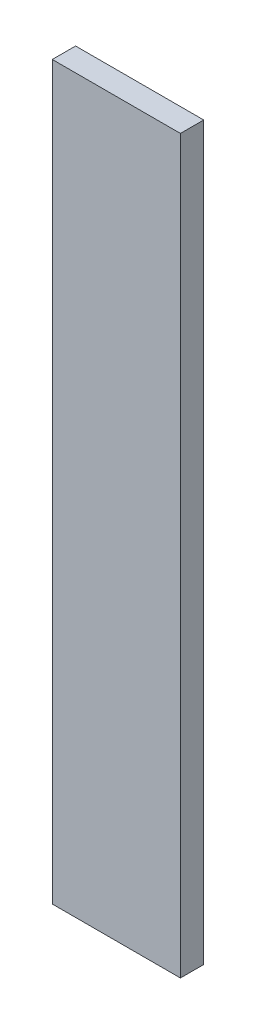
ISO-10303-21;
HEADER;
FILE_DESCRIPTION(('STEP AP214'),'2;1');
FILE_NAME('part.step','',(''),(''),'','','');
FILE_SCHEMA(('AUTOMOTIVE_DESIGN { 1 0 10303 214 1 1 1 1 }'));
ENDSEC;
DATA;
#1=APPLICATION_CONTEXT('core data for automotive mechanical design processes');
#2=APPLICATION_PROTOCOL_DEFINITION('international standard','automotive_design',2000,#1);
#3=PRODUCT_CONTEXT('',#1,'mechanical');
#4=PRODUCT('Part','Part','',(#3));
#5=PRODUCT_RELATED_PRODUCT_CATEGORY('part','',(#4));
#6=PRODUCT_DEFINITION_FORMATION('','',#4);
#7=PRODUCT_DEFINITION_CONTEXT('part definition',#1,'design');
#8=PRODUCT_DEFINITION('design','',#6,#7);
#9=PRODUCT_DEFINITION_SHAPE('','',#8);
#10=(LENGTH_UNIT() NAMED_UNIT(*) SI_UNIT(.MILLI.,.METRE.));
#11=(NAMED_UNIT(*) PLANE_ANGLE_UNIT() SI_UNIT($,.RADIAN.));
#12=(NAMED_UNIT(*) SI_UNIT($,.STERADIAN.) SOLID_ANGLE_UNIT());
#13=UNCERTAINTY_MEASURE_WITH_UNIT(LENGTH_MEASURE(1.E-05),#10,'distance_accuracy_value','');
#14=(GEOMETRIC_REPRESENTATION_CONTEXT(3) GLOBAL_UNCERTAINTY_ASSIGNED_CONTEXT((#13)) GLOBAL_UNIT_ASSIGNED_CONTEXT((#10,
#11,#12)) REPRESENTATION_CONTEXT('',''));
#15=CARTESIAN_POINT('',(0.,0.,0.));
#16=DIRECTION('',(0.,0.,1.));
#17=DIRECTION('',(1.,0.,0.));
#18=AXIS2_PLACEMENT_3D('',#15,#16,#17);
#19=CARTESIAN_POINT('',(0.,80.,-75.5));
#20=DIRECTION('',(0.,0.,-1.));
#21=DIRECTION('',(-1.,0.,0.));
#22=AXIS2_PLACEMENT_3D('',#19,#20,#21);
#23=PLANE('',#22);
#24=DIRECTION('',(-1.,0.,0.));
#25=VECTOR('',#24,1.);
#26=CARTESIAN_POINT('',(-18.25,9.,-75.5));
#27=LINE('',#26,#25);
#28=CARTESIAN_POINT('',(5.5,9.,-75.5));
#29=VERTEX_POINT('',#28);
#30=CARTESIAN_POINT('',(-5.5,8.99999999999999,-75.5));
#31=VERTEX_POINT('',#30);
#32=EDGE_CURVE('E45',#29,#31,#27,.T.);
#33=ORIENTED_EDGE('',*,*,#32,.F.);
#34=DIRECTION('',(0.,1.,0.));
#35=VECTOR('',#34,1.);
#36=CARTESIAN_POINT('',(5.5,80.,-75.5));
#37=LINE('',#36,#35);
#38=CARTESIAN_POINT('',(5.5,71.8,-75.5));
#39=VERTEX_POINT('',#38);
#40=EDGE_CURVE('E60',#29,#39,#37,.T.);
#41=ORIENTED_EDGE('',*,*,#40,.T.);
#42=DIRECTION('',(-1.,0.,0.));
#43=VECTOR('',#42,1.);
#44=CARTESIAN_POINT('',(21.9721359549996,71.8,-75.5));
#45=LINE('',#44,#43);
#46=CARTESIAN_POINT('',(-5.5,71.8,-75.5));
#47=VERTEX_POINT('',#46);
#48=EDGE_CURVE('E11',#39,#47,#45,.T.);
#49=ORIENTED_EDGE('',*,*,#48,.T.);
#50=DIRECTION('',(0.,1.,0.));
#51=VECTOR('',#50,1.);
#52=CARTESIAN_POINT('',(-5.5,80.,-75.5));
#53=LINE('',#52,#51);
#54=EDGE_CURVE('E90',#31,#47,#53,.T.);
#55=ORIENTED_EDGE('',*,*,#54,.F.);
#56=EDGE_LOOP('',(#33,#41,#49,#55));
#57=FACE_BOUND('',#56,.T.);
#58=ADVANCED_FACE('F37',(#57),#23,.F.);
#59=CARTESIAN_POINT('',(-19.5,2.,-77.5));
#60=DIRECTION('',(0.,0.,1.));
#61=DIRECTION('',(1.,0.,0.));
#62=AXIS2_PLACEMENT_3D('',#59,#60,#61);
#63=PLANE('',#62);
#64=DIRECTION('',(0.,-1.,0.));
#65=VECTOR('',#64,1.);
#66=CARTESIAN_POINT('',(-5.5,0.,-77.5));
#67=LINE('',#66,#65);
#68=CARTESIAN_POINT('',(-5.5,71.8,-77.5));
#69=VERTEX_POINT('',#68);
#70=CARTESIAN_POINT('',(-5.5,8.99999999999999,-77.5));
#71=VERTEX_POINT('',#70);
#72=EDGE_CURVE('E52',#69,#71,#67,.T.);
#73=ORIENTED_EDGE('',*,*,#72,.F.);
#74=DIRECTION('',(1.,0.,0.));
#75=VECTOR('',#74,1.);
#76=CARTESIAN_POINT('',(-5.5,71.8,-77.5));
#77=LINE('',#76,#75);
#78=CARTESIAN_POINT('',(5.5,71.8,-77.5));
#79=VERTEX_POINT('',#78);
#80=EDGE_CURVE('E80',#69,#79,#77,.T.);
#81=ORIENTED_EDGE('',*,*,#80,.T.);
#82=DIRECTION('',(0.,-1.,0.));
#83=VECTOR('',#82,1.);
#84=CARTESIAN_POINT('',(5.5,0.,-77.5));
#85=LINE('',#84,#83);
#86=CARTESIAN_POINT('',(5.5,8.99999999999999,-77.5));
#87=VERTEX_POINT('',#86);
#88=EDGE_CURVE('E97',#79,#87,#85,.T.);
#89=ORIENTED_EDGE('',*,*,#88,.T.);
#90=DIRECTION('',(1.,0.,0.));
#91=VECTOR('',#90,1.);
#92=CARTESIAN_POINT('',(0.,8.99999999999999,-77.5));
#93=LINE('',#92,#91);
#94=EDGE_CURVE('E94',#71,#87,#93,.T.);
#95=ORIENTED_EDGE('',*,*,#94,.F.);
#96=EDGE_LOOP('',(#73,#81,#89,#95));
#97=FACE_BOUND('',#96,.T.);
#98=ADVANCED_FACE('F39',(#97),#63,.F.);
#99=CARTESIAN_POINT('',(0.,8.99999999999999,-77.5));
#100=DIRECTION('',(0.,-1.,0.));
#101=DIRECTION('',(0.,0.,-1.));
#102=AXIS2_PLACEMENT_3D('',#99,#100,#101);
#103=PLANE('',#102);
#104=DIRECTION('',(0.,0.,1.));
#105=VECTOR('',#104,1.);
#106=CARTESIAN_POINT('',(5.5,8.99999999999999,-77.5));
#107=LINE('',#106,#105);
#108=EDGE_CURVE('E101',#87,#29,#107,.T.);
#109=ORIENTED_EDGE('',*,*,#108,.T.);
#110=ORIENTED_EDGE('',*,*,#32,.T.);
#111=DIRECTION('',(0.,0.,1.));
#112=VECTOR('',#111,1.);
#113=CARTESIAN_POINT('',(-5.5,8.99999999999999,-77.5));
#114=LINE('',#113,#112);
#115=EDGE_CURVE('E95',#71,#31,#114,.T.);
#116=ORIENTED_EDGE('',*,*,#115,.F.);
#117=ORIENTED_EDGE('',*,*,#94,.T.);
#118=EDGE_LOOP('',(#109,#110,#116,#117));
#119=FACE_BOUND('',#118,.T.);
#120=ADVANCED_FACE('F109',(#119),#103,.T.);
#121=CARTESIAN_POINT('',(-5.5,0.,-77.5));
#122=DIRECTION('',(-1.,0.,0.));
#123=DIRECTION('',(0.,0.,1.));
#124=AXIS2_PLACEMENT_3D('',#121,#122,#123);
#125=PLANE('',#124);
#126=DIRECTION('',(0.,0.,1.));
#127=VECTOR('',#126,1.);
#128=CARTESIAN_POINT('',(-5.5,71.8,-77.5));
#129=LINE('',#128,#127);
#130=EDGE_CURVE('E82',#69,#47,#129,.T.);
#131=ORIENTED_EDGE('',*,*,#130,.F.);
#132=ORIENTED_EDGE('',*,*,#72,.T.);
#133=ORIENTED_EDGE('',*,*,#115,.T.);
#134=ORIENTED_EDGE('',*,*,#54,.T.);
#135=EDGE_LOOP('',(#131,#132,#133,#134));
#136=FACE_BOUND('',#135,.T.);
#137=ADVANCED_FACE('F88',(#136),#125,.T.);
#138=CARTESIAN_POINT('',(5.5,0.,-77.5));
#139=DIRECTION('',(-1.,0.,0.));
#140=DIRECTION('',(0.,0.,1.));
#141=AXIS2_PLACEMENT_3D('',#138,#139,#140);
#142=PLANE('',#141);
#143=ORIENTED_EDGE('',*,*,#88,.F.);
#144=DIRECTION('',(0.,0.,1.));
#145=VECTOR('',#144,1.);
#146=CARTESIAN_POINT('',(5.5,71.8,-77.5));
#147=LINE('',#146,#145);
#148=EDGE_CURVE('E84',#79,#39,#147,.T.);
#149=ORIENTED_EDGE('',*,*,#148,.T.);
#150=ORIENTED_EDGE('',*,*,#40,.F.);
#151=ORIENTED_EDGE('',*,*,#108,.F.);
#152=EDGE_LOOP('',(#143,#149,#150,#151));
#153=FACE_BOUND('',#152,.T.);
#154=ADVANCED_FACE('F111',(#153),#142,.F.);
#155=CARTESIAN_POINT('',(-5.5,71.8,-77.5));
#156=DIRECTION('',(0.,-1.,0.));
#157=DIRECTION('',(0.,0.,-1.));
#158=AXIS2_PLACEMENT_3D('',#155,#156,#157);
#159=PLANE('',#158);
#160=ORIENTED_EDGE('',*,*,#148,.F.);
#161=ORIENTED_EDGE('',*,*,#80,.F.);
#162=ORIENTED_EDGE('',*,*,#130,.T.);
#163=ORIENTED_EDGE('',*,*,#48,.F.);
#164=EDGE_LOOP('',(#160,#161,#162,#163));
#165=FACE_BOUND('',#164,.T.);
#166=ADVANCED_FACE('F81',(#165),#159,.F.);
#167=CLOSED_SHELL('',(#58,#98,#120,#137,#154,#166));
#168=MANIFOLD_SOLID_BREP('B2',#167);
#169=ADVANCED_BREP_SHAPE_REPRESENTATION('',(#18,#168),#14);
#170=SHAPE_DEFINITION_REPRESENTATION(#9,#169);
ENDSEC;
END-ISO-10303-21;
